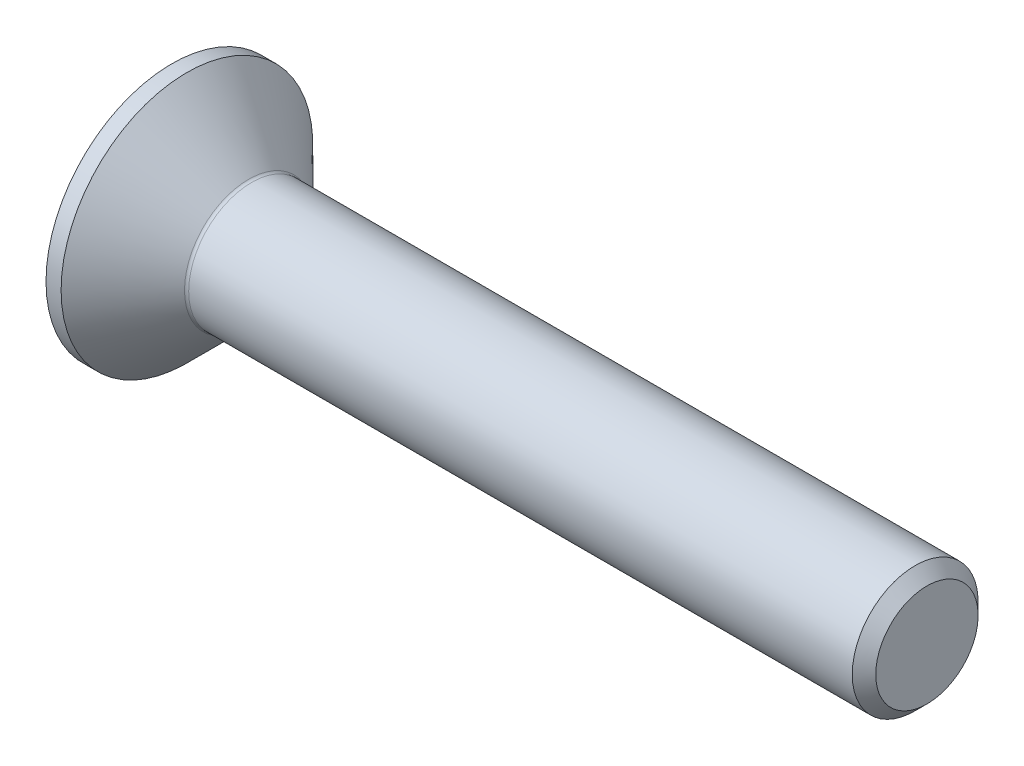
ISO-10303-21;
HEADER;
FILE_DESCRIPTION(('STEP AP214'),'2;1');
FILE_NAME('part.step','',(''),(''),'','','');
FILE_SCHEMA(('AUTOMOTIVE_DESIGN { 1 0 10303 214 1 1 1 1 }'));
ENDSEC;
DATA;
#1=APPLICATION_CONTEXT('core data for automotive mechanical design processes');
#2=APPLICATION_PROTOCOL_DEFINITION('international standard','automotive_design',2000,#1);
#3=PRODUCT_CONTEXT('',#1,'mechanical');
#4=PRODUCT('Part','Part','',(#3));
#5=PRODUCT_RELATED_PRODUCT_CATEGORY('part','',(#4));
#6=PRODUCT_DEFINITION_FORMATION('','',#4);
#7=PRODUCT_DEFINITION_CONTEXT('part definition',#1,'design');
#8=PRODUCT_DEFINITION('design','',#6,#7);
#9=PRODUCT_DEFINITION_SHAPE('','',#8);
#10=(LENGTH_UNIT() NAMED_UNIT(*) SI_UNIT(.MILLI.,.METRE.));
#11=(NAMED_UNIT(*) PLANE_ANGLE_UNIT() SI_UNIT($,.RADIAN.));
#12=(NAMED_UNIT(*) SI_UNIT($,.STERADIAN.) SOLID_ANGLE_UNIT());
#13=UNCERTAINTY_MEASURE_WITH_UNIT(LENGTH_MEASURE(1.E-05),#10,'distance_accuracy_value','');
#14=(GEOMETRIC_REPRESENTATION_CONTEXT(3) GLOBAL_UNCERTAINTY_ASSIGNED_CONTEXT((#13)) GLOBAL_UNIT_ASSIGNED_CONTEXT((#10,
#11,#12)) REPRESENTATION_CONTEXT('',''));
#15=CARTESIAN_POINT('',(0.,0.,0.));
#16=DIRECTION('',(0.,0.,1.));
#17=DIRECTION('',(1.,0.,0.));
#18=AXIS2_PLACEMENT_3D('',#15,#16,#17);
#19=CARTESIAN_POINT('',(0.,0.,0.));
#20=DIRECTION('',(-1.,0.,0.));
#21=DIRECTION('',(0.,0.,1.));
#22=AXIS2_PLACEMENT_3D('',#19,#20,#21);
#23=PLANE('',#22);
#24=CARTESIAN_POINT('',(0.,0.,0.));
#25=DIRECTION('',(-1.,0.,0.));
#26=DIRECTION('',(0.,0.,1.));
#27=AXIS2_PLACEMENT_3D('',#24,#25,#26);
#28=CIRCLE('',#27,3.);
#29=CARTESIAN_POINT('',(0.,0.,3.));
#30=VERTEX_POINT('',#29);
#31=EDGE_CURVE('E154',#30,#30,#28,.T.);
#32=ORIENTED_EDGE('',*,*,#31,.T.);
#33=EDGE_LOOP('',(#32));
#34=FACE_BOUND('',#33,.T.);
#35=DIRECTION('',(0.,-0.499999999999998,-0.86602540378444));
#36=VECTOR('',#35,1.);
#37=CARTESIAN_POINT('',(0.,-0.577350269189626,1.));
#38=LINE('',#37,#36);
#39=CARTESIAN_POINT('',(0.,-0.577350269189626,1.));
#40=VERTEX_POINT('',#39);
#41=CARTESIAN_POINT('',(0.,-1.15470053837925,0.));
#42=VERTEX_POINT('',#41);
#43=EDGE_CURVE('E120',#40,#42,#38,.T.);
#44=ORIENTED_EDGE('',*,*,#43,.T.);
#45=DIRECTION('',(0.,0.499999999999999,-0.866025403784439));
#46=VECTOR('',#45,1.);
#47=CARTESIAN_POINT('',(0.,-1.15470053837925,0.));
#48=LINE('',#47,#46);
#49=CARTESIAN_POINT('',(0.,-0.577350269189625,-1.));
#50=VERTEX_POINT('',#49);
#51=EDGE_CURVE('E51',#42,#50,#48,.T.);
#52=ORIENTED_EDGE('',*,*,#51,.T.);
#53=DIRECTION('',(0.,1.,0.));
#54=VECTOR('',#53,1.);
#55=CARTESIAN_POINT('',(0.,-0.577350269189625,-1.));
#56=LINE('',#55,#54);
#57=CARTESIAN_POINT('',(0.,0.577350269189626,-1.));
#58=VERTEX_POINT('',#57);
#59=EDGE_CURVE('E131',#50,#58,#56,.T.);
#60=ORIENTED_EDGE('',*,*,#59,.T.);
#61=DIRECTION('',(0.,0.5,0.866025403784439));
#62=VECTOR('',#61,1.);
#63=CARTESIAN_POINT('',(0.,0.577350269189626,-1.));
#64=LINE('',#63,#62);
#65=CARTESIAN_POINT('',(0.,1.15470053837925,0.));
#66=VERTEX_POINT('',#65);
#67=EDGE_CURVE('E255',#58,#66,#64,.T.);
#68=ORIENTED_EDGE('',*,*,#67,.T.);
#69=DIRECTION('',(0.,-0.499999999999999,0.866025403784439));
#70=VECTOR('',#69,1.);
#71=CARTESIAN_POINT('',(0.,1.15470053837925,0.));
#72=LINE('',#71,#70);
#73=CARTESIAN_POINT('',(0.,0.577350269189625,0.999999999999999));
#74=VERTEX_POINT('',#73);
#75=EDGE_CURVE('E258',#66,#74,#72,.T.);
#76=ORIENTED_EDGE('',*,*,#75,.T.);
#77=DIRECTION('',(0.,-1.,0.));
#78=VECTOR('',#77,1.);
#79=CARTESIAN_POINT('',(0.,0.577350269189625,0.999999999999999));
#80=LINE('',#79,#78);
#81=EDGE_CURVE('E261',#74,#40,#80,.T.);
#82=ORIENTED_EDGE('',*,*,#81,.T.);
#83=EDGE_LOOP('',(#44,#52,#60,#68,#76,#82));
#84=FACE_BOUND('',#83,.T.);
#85=ADVANCED_FACE('F36',(#34,#84),#23,.T.);
#86=CARTESIAN_POINT('',(0.,0.,0.));
#87=DIRECTION('',(-1.,0.,0.));
#88=DIRECTION('',(0.,0.,1.));
#89=AXIS2_PLACEMENT_3D('',#86,#87,#88);
#90=CYLINDRICAL_SURFACE('',#89,3.);
#91=CARTESIAN_POINT('',(0.36000000000001,0.,0.));
#92=DIRECTION('',(-1.,0.,0.));
#93=DIRECTION('',(0.,0.,1.));
#94=AXIS2_PLACEMENT_3D('',#91,#92,#93);
#95=CIRCLE('',#94,3.);
#96=CARTESIAN_POINT('',(0.36000000000001,0.,3.));
#97=VERTEX_POINT('',#96);
#98=EDGE_CURVE('E151',#97,#97,#95,.T.);
#99=ORIENTED_EDGE('',*,*,#98,.T.);
#100=EDGE_LOOP('',(#99));
#101=FACE_BOUND('',#100,.T.);
#102=ORIENTED_EDGE('',*,*,#31,.F.);
#103=EDGE_LOOP('',(#102));
#104=FACE_BOUND('',#103,.T.);
#105=ADVANCED_FACE('F175',(#101,#104),#90,.T.);
#106=CARTESIAN_POINT('',(0.36000000000001,0.,0.));
#107=DIRECTION('',(-1.,0.,0.));
#108=DIRECTION('',(0.,0.,1.));
#109=AXIS2_PLACEMENT_3D('',#106,#107,#108);
#110=CONICAL_SURFACE('',#109,3.,0.785398163397449);
#111=CARTESIAN_POINT('',(1.83071067811874,0.,0.));
#112=DIRECTION('',(-1.,0.,0.));
#113=DIRECTION('',(0.,0.,1.));
#114=AXIS2_PLACEMENT_3D('',#111,#112,#113);
#115=CIRCLE('',#114,1.52928932188126);
#116=CARTESIAN_POINT('',(1.83071067811874,0.,1.52928932188126));
#117=VERTEX_POINT('',#116);
#118=EDGE_CURVE('E44',#117,#117,#115,.T.);
#119=ORIENTED_EDGE('',*,*,#118,.T.);
#120=EDGE_LOOP('',(#119));
#121=FACE_BOUND('',#120,.T.);
#122=ORIENTED_EDGE('',*,*,#98,.F.);
#123=EDGE_LOOP('',(#122));
#124=FACE_BOUND('',#123,.T.);
#125=ADVANCED_FACE('F159',(#121,#124),#110,.T.);
#126=CARTESIAN_POINT('',(0.,0.,0.));
#127=DIRECTION('',(-1.,0.,0.));
#128=DIRECTION('',(0.,0.,1.));
#129=AXIS2_PLACEMENT_3D('',#126,#127,#128);
#130=CYLINDRICAL_SURFACE('',#129,1.49999999999992);
#131=CARTESIAN_POINT('',(1.9014213562374,0.,0.));
#132=DIRECTION('',(-1.,0.,0.));
#133=DIRECTION('',(0.,0.,1.));
#134=AXIS2_PLACEMENT_3D('',#131,#132,#133);
#135=CIRCLE('',#134,1.49999999999992);
#136=CARTESIAN_POINT('',(1.9014213562374,0.,1.49999999999992));
#137=VERTEX_POINT('',#136);
#138=EDGE_CURVE('E11',#137,#137,#135,.F.);
#139=ORIENTED_EDGE('',*,*,#138,.T.);
#140=EDGE_LOOP('',(#139));
#141=FACE_BOUND('',#140,.T.);
#142=CARTESIAN_POINT('',(17.7194999999998,0.,0.));
#143=DIRECTION('',(-1.,0.,0.));
#144=DIRECTION('',(0.,0.,1.));
#145=AXIS2_PLACEMENT_3D('',#142,#143,#144);
#146=CIRCLE('',#145,1.49999999999983);
#147=CARTESIAN_POINT('',(17.7194999999998,0.,1.49999999999983));
#148=VERTEX_POINT('',#147);
#149=EDGE_CURVE('E148',#148,#148,#146,.T.);
#150=ORIENTED_EDGE('',*,*,#149,.T.);
#151=EDGE_LOOP('',(#150));
#152=FACE_BOUND('',#151,.T.);
#153=ADVANCED_FACE('F186',(#141,#152),#130,.T.);
#154=CARTESIAN_POINT('',(18.,0.,0.));
#155=DIRECTION('',(-1.,0.,0.));
#156=DIRECTION('',(0.,0.,1.));
#157=AXIS2_PLACEMENT_3D('',#154,#155,#156);
#158=CONICAL_SURFACE('',#157,1.2195,0.785398163396876);
#159=ORIENTED_EDGE('',*,*,#149,.F.);
#160=EDGE_LOOP('',(#159));
#161=FACE_BOUND('',#160,.T.);
#162=CARTESIAN_POINT('',(18.,0.,0.));
#163=DIRECTION('',(-1.,0.,0.));
#164=DIRECTION('',(0.,0.,1.));
#165=AXIS2_PLACEMENT_3D('',#162,#163,#164);
#166=CIRCLE('',#165,1.2195);
#167=CARTESIAN_POINT('',(18.,0.,1.2195));
#168=VERTEX_POINT('',#167);
#169=EDGE_CURVE('E144',#168,#168,#166,.T.);
#170=ORIENTED_EDGE('',*,*,#169,.T.);
#171=EDGE_LOOP('',(#170));
#172=FACE_BOUND('',#171,.T.);
#173=ADVANCED_FACE('F170',(#161,#172),#158,.T.);
#174=CARTESIAN_POINT('',(18.,1.2195,0.));
#175=DIRECTION('',(1.,0.,0.));
#176=DIRECTION('',(0.,0.,-1.));
#177=AXIS2_PLACEMENT_3D('',#174,#175,#176);
#178=PLANE('',#177);
#179=ORIENTED_EDGE('',*,*,#169,.F.);
#180=EDGE_LOOP('',(#179));
#181=FACE_BOUND('',#180,.T.);
#182=ADVANCED_FACE('F163',(#181),#178,.T.);
#183=CARTESIAN_POINT('',(1.9014213562374,0.,0.));
#184=DIRECTION('',(-1.,0.,0.));
#185=DIRECTION('',(0.,0.,1.));
#186=AXIS2_PLACEMENT_3D('',#183,#184,#185);
#187=TOROIDAL_SURFACE('',#186,1.59999999999992,0.1);
#188=ORIENTED_EDGE('',*,*,#138,.F.);
#189=EDGE_LOOP('',(#188));
#190=FACE_BOUND('',#189,.T.);
#191=ORIENTED_EDGE('',*,*,#118,.F.);
#192=EDGE_LOOP('',(#191));
#193=FACE_BOUND('',#192,.T.);
#194=ADVANCED_FACE('F38',(#190,#193),#187,.F.);
#195=CARTESIAN_POINT('',(1.1,-1.15470053837925,0.));
#196=DIRECTION('',(0.,0.866025403784439,0.499999999999999));
#197=DIRECTION('',(0.,-0.499999999999999,0.866025403784439));
#198=AXIS2_PLACEMENT_3D('',#195,#196,#197);
#199=PLANE('',#198);
#200=ORIENTED_EDGE('',*,*,#51,.F.);
#201=DIRECTION('',(-1.,0.,0.));
#202=VECTOR('',#201,1.);
#203=CARTESIAN_POINT('',(1.1,-1.15470053837925,0.));
#204=LINE('',#203,#202);
#205=CARTESIAN_POINT('',(1.1,-1.15470053837925,0.));
#206=VERTEX_POINT('',#205);
#207=EDGE_CURVE('E252',#206,#42,#204,.T.);
#208=ORIENTED_EDGE('',*,*,#207,.F.);
#209=DIRECTION('',(0.,0.499999999999999,-0.866025403784439));
#210=VECTOR('',#209,1.);
#211=CARTESIAN_POINT('',(1.1,-1.15470053837925,0.));
#212=LINE('',#211,#210);
#213=CARTESIAN_POINT('',(1.1,-0.866025403784438,-0.499999999999998));
#214=VERTEX_POINT('',#213);
#215=EDGE_CURVE('E116',#206,#214,#212,.T.);
#216=ORIENTED_EDGE('',*,*,#215,.T.);
#217=CARTESIAN_POINT('',(1.1,-0.577350269189625,-1.));
#218=VERTEX_POINT('',#217);
#219=EDGE_CURVE('E112',#214,#218,#212,.T.);
#220=ORIENTED_EDGE('',*,*,#219,.T.);
#221=DIRECTION('',(-1.,0.,0.));
#222=VECTOR('',#221,1.);
#223=CARTESIAN_POINT('',(1.1,-0.577350269189625,-1.));
#224=LINE('',#223,#222);
#225=EDGE_CURVE('E114',#218,#50,#224,.T.);
#226=ORIENTED_EDGE('',*,*,#225,.T.);
#227=EDGE_LOOP('',(#200,#208,#216,#220,#226));
#228=FACE_BOUND('',#227,.T.);
#229=ADVANCED_FACE('F113',(#228),#199,.T.);
#230=CARTESIAN_POINT('',(1.1,-0.577350269189625,-1.));
#231=DIRECTION('',(0.,0.,1.));
#232=DIRECTION('',(1.,0.,0.));
#233=AXIS2_PLACEMENT_3D('',#230,#231,#232);
#234=PLANE('',#233);
#235=ORIENTED_EDGE('',*,*,#59,.F.);
#236=ORIENTED_EDGE('',*,*,#225,.F.);
#237=DIRECTION('',(0.,1.,0.));
#238=VECTOR('',#237,1.);
#239=CARTESIAN_POINT('',(1.1,-0.577350269189625,-1.));
#240=LINE('',#239,#238);
#241=CARTESIAN_POINT('',(1.1,0.,-1.));
#242=VERTEX_POINT('',#241);
#243=EDGE_CURVE('E59',#218,#242,#240,.T.);
#244=ORIENTED_EDGE('',*,*,#243,.T.);
#245=CARTESIAN_POINT('',(1.1,0.577350269189626,-1.));
#246=VERTEX_POINT('',#245);
#247=EDGE_CURVE('E126',#242,#246,#240,.T.);
#248=ORIENTED_EDGE('',*,*,#247,.T.);
#249=DIRECTION('',(-1.,0.,0.));
#250=VECTOR('',#249,1.);
#251=CARTESIAN_POINT('',(1.1,0.577350269189626,-1.));
#252=LINE('',#251,#250);
#253=EDGE_CURVE('E133',#246,#58,#252,.T.);
#254=ORIENTED_EDGE('',*,*,#253,.T.);
#255=EDGE_LOOP('',(#235,#236,#244,#248,#254));
#256=FACE_BOUND('',#255,.T.);
#257=ADVANCED_FACE('F128',(#256),#234,.T.);
#258=CARTESIAN_POINT('',(1.1,0.577350269189626,-1.));
#259=DIRECTION('',(0.,-0.866025403784438,0.5));
#260=DIRECTION('',(0.,-0.5,-0.866025403784439));
#261=AXIS2_PLACEMENT_3D('',#258,#259,#260);
#262=PLANE('',#261);
#263=ORIENTED_EDGE('',*,*,#67,.F.);
#264=ORIENTED_EDGE('',*,*,#253,.F.);
#265=DIRECTION('',(0.,0.5,0.866025403784439));
#266=VECTOR('',#265,1.);
#267=CARTESIAN_POINT('',(1.1,0.577350269189626,-1.));
#268=LINE('',#267,#266);
#269=CARTESIAN_POINT('',(1.1,0.866025403784439,-0.5));
#270=VERTEX_POINT('',#269);
#271=EDGE_CURVE('E233',#246,#270,#268,.T.);
#272=ORIENTED_EDGE('',*,*,#271,.T.);
#273=CARTESIAN_POINT('',(1.1,1.15470053837925,0.));
#274=VERTEX_POINT('',#273);
#275=EDGE_CURVE('E125',#270,#274,#268,.T.);
#276=ORIENTED_EDGE('',*,*,#275,.T.);
#277=DIRECTION('',(-1.,0.,0.));
#278=VECTOR('',#277,1.);
#279=CARTESIAN_POINT('',(1.1,1.15470053837925,0.));
#280=LINE('',#279,#278);
#281=EDGE_CURVE('E139',#274,#66,#280,.T.);
#282=ORIENTED_EDGE('',*,*,#281,.T.);
#283=EDGE_LOOP('',(#263,#264,#272,#276,#282));
#284=FACE_BOUND('',#283,.T.);
#285=ADVANCED_FACE('F200',(#284),#262,.T.);
#286=CARTESIAN_POINT('',(1.1,1.15470053837925,0.));
#287=DIRECTION('',(0.,-0.866025403784439,-0.499999999999999));
#288=DIRECTION('',(0.,0.499999999999999,-0.866025403784439));
#289=AXIS2_PLACEMENT_3D('',#286,#287,#288);
#290=PLANE('',#289);
#291=ORIENTED_EDGE('',*,*,#75,.F.);
#292=ORIENTED_EDGE('',*,*,#281,.F.);
#293=DIRECTION('',(0.,-0.499999999999999,0.866025403784439));
#294=VECTOR('',#293,1.);
#295=CARTESIAN_POINT('',(1.1,1.15470053837925,0.));
#296=LINE('',#295,#294);
#297=CARTESIAN_POINT('',(1.1,0.866025403784438,0.499999999999999));
#298=VERTEX_POINT('',#297);
#299=EDGE_CURVE('E240',#274,#298,#296,.T.);
#300=ORIENTED_EDGE('',*,*,#299,.T.);
#301=CARTESIAN_POINT('',(1.1,0.577350269189625,0.999999999999999));
#302=VERTEX_POINT('',#301);
#303=EDGE_CURVE('E238',#298,#302,#296,.T.);
#304=ORIENTED_EDGE('',*,*,#303,.T.);
#305=DIRECTION('',(-1.,0.,0.));
#306=VECTOR('',#305,1.);
#307=CARTESIAN_POINT('',(1.1,0.577350269189625,0.999999999999999));
#308=LINE('',#307,#306);
#309=EDGE_CURVE('E270',#302,#74,#308,.T.);
#310=ORIENTED_EDGE('',*,*,#309,.T.);
#311=EDGE_LOOP('',(#291,#292,#300,#304,#310));
#312=FACE_BOUND('',#311,.T.);
#313=ADVANCED_FACE('F203',(#312),#290,.T.);
#314=CARTESIAN_POINT('',(1.1,0.577350269189625,0.999999999999999));
#315=DIRECTION('',(0.,0.,-1.));
#316=DIRECTION('',(0.,1.,0.));
#317=AXIS2_PLACEMENT_3D('',#314,#315,#316);
#318=PLANE('',#317);
#319=ORIENTED_EDGE('',*,*,#81,.F.);
#320=ORIENTED_EDGE('',*,*,#309,.F.);
#321=DIRECTION('',(0.,-1.,0.));
#322=VECTOR('',#321,1.);
#323=CARTESIAN_POINT('',(1.1,0.577350269189625,0.999999999999999));
#324=LINE('',#323,#322);
#325=CARTESIAN_POINT('',(1.1,0.,1.));
#326=VERTEX_POINT('',#325);
#327=EDGE_CURVE('E245',#302,#326,#324,.T.);
#328=ORIENTED_EDGE('',*,*,#327,.T.);
#329=CARTESIAN_POINT('',(1.1,-0.577350269189626,1.));
#330=VERTEX_POINT('',#329);
#331=EDGE_CURVE('E244',#326,#330,#324,.T.);
#332=ORIENTED_EDGE('',*,*,#331,.T.);
#333=DIRECTION('',(-1.,0.,0.));
#334=VECTOR('',#333,1.);
#335=CARTESIAN_POINT('',(1.1,-0.577350269189626,1.));
#336=LINE('',#335,#334);
#337=EDGE_CURVE('E267',#330,#40,#336,.T.);
#338=ORIENTED_EDGE('',*,*,#337,.T.);
#339=EDGE_LOOP('',(#319,#320,#328,#332,#338));
#340=FACE_BOUND('',#339,.T.);
#341=ADVANCED_FACE('F207',(#340),#318,.T.);
#342=CARTESIAN_POINT('',(1.1,-0.577350269189626,1.));
#343=DIRECTION('',(0.,0.86602540378444,-0.499999999999998));
#344=DIRECTION('',(0.,0.499999999999998,0.86602540378444));
#345=AXIS2_PLACEMENT_3D('',#342,#343,#344);
#346=PLANE('',#345);
#347=ORIENTED_EDGE('',*,*,#43,.F.);
#348=ORIENTED_EDGE('',*,*,#337,.F.);
#349=DIRECTION('',(0.,-0.499999999999998,-0.86602540378444));
#350=VECTOR('',#349,1.);
#351=CARTESIAN_POINT('',(1.1,-0.577350269189626,1.));
#352=LINE('',#351,#350);
#353=CARTESIAN_POINT('',(1.1,-0.866025403784439,0.499999999999997));
#354=VERTEX_POINT('',#353);
#355=EDGE_CURVE('E249',#330,#354,#352,.T.);
#356=ORIENTED_EDGE('',*,*,#355,.T.);
#357=EDGE_CURVE('E248',#354,#206,#352,.T.);
#358=ORIENTED_EDGE('',*,*,#357,.T.);
#359=ORIENTED_EDGE('',*,*,#207,.T.);
#360=EDGE_LOOP('',(#347,#348,#356,#358,#359));
#361=FACE_BOUND('',#360,.T.);
#362=ADVANCED_FACE('F211',(#361),#346,.T.);
#363=CARTESIAN_POINT('',(1.1,-0.577350269189626,-1.));
#364=DIRECTION('',(1.,0.,0.));
#365=DIRECTION('',(0.,0.,-1.));
#366=AXIS2_PLACEMENT_3D('',#363,#364,#365);
#367=PLANE('',#366);
#368=ORIENTED_EDGE('',*,*,#243,.F.);
#369=ORIENTED_EDGE('',*,*,#219,.F.);
#370=CARTESIAN_POINT('',(1.1,0.,0.));
#371=DIRECTION('',(-1.,0.,0.));
#372=DIRECTION('',(0.,0.,1.));
#373=AXIS2_PLACEMENT_3D('',#370,#371,#372);
#374=CIRCLE('',#373,1.);
#375=EDGE_CURVE('E123',#242,#214,#374,.T.);
#376=ORIENTED_EDGE('',*,*,#375,.F.);
#377=EDGE_LOOP('',(#368,#369,#376));
#378=FACE_BOUND('',#377,.T.);
#379=ADVANCED_FACE('F122',(#378),#367,.F.);
#380=ORIENTED_EDGE('',*,*,#215,.F.);
#381=ORIENTED_EDGE('',*,*,#357,.F.);
#382=EDGE_CURVE('E136',#214,#354,#374,.T.);
#383=ORIENTED_EDGE('',*,*,#382,.F.);
#384=EDGE_LOOP('',(#380,#381,#383));
#385=FACE_BOUND('',#384,.T.);
#386=ADVANCED_FACE('F217',(#385),#367,.F.);
#387=ORIENTED_EDGE('',*,*,#355,.F.);
#388=ORIENTED_EDGE('',*,*,#331,.F.);
#389=EDGE_CURVE('E132',#354,#326,#374,.T.);
#390=ORIENTED_EDGE('',*,*,#389,.F.);
#391=EDGE_LOOP('',(#387,#388,#390));
#392=FACE_BOUND('',#391,.T.);
#393=ADVANCED_FACE('F221',(#392),#367,.F.);
#394=ORIENTED_EDGE('',*,*,#327,.F.);
#395=ORIENTED_EDGE('',*,*,#303,.F.);
#396=EDGE_CURVE('E138',#326,#298,#374,.T.);
#397=ORIENTED_EDGE('',*,*,#396,.F.);
#398=EDGE_LOOP('',(#394,#395,#397));
#399=FACE_BOUND('',#398,.T.);
#400=ADVANCED_FACE('F229',(#399),#367,.F.);
#401=ORIENTED_EDGE('',*,*,#299,.F.);
#402=ORIENTED_EDGE('',*,*,#275,.F.);
#403=EDGE_CURVE('E145',#298,#270,#374,.T.);
#404=ORIENTED_EDGE('',*,*,#403,.F.);
#405=EDGE_LOOP('',(#401,#402,#404));
#406=FACE_BOUND('',#405,.T.);
#407=ADVANCED_FACE('F224',(#406),#367,.F.);
#408=ORIENTED_EDGE('',*,*,#271,.F.);
#409=ORIENTED_EDGE('',*,*,#247,.F.);
#410=EDGE_CURVE('E234',#270,#242,#374,.T.);
#411=ORIENTED_EDGE('',*,*,#410,.F.);
#412=EDGE_LOOP('',(#408,#409,#411));
#413=FACE_BOUND('',#412,.T.);
#414=ADVANCED_FACE('F195',(#413),#367,.F.);
#415=CARTESIAN_POINT('',(1.1,0.,0.));
#416=DIRECTION('',(-1.,0.,0.));
#417=DIRECTION('',(0.,0.,1.));
#418=AXIS2_PLACEMENT_3D('',#415,#416,#417);
#419=CONICAL_SURFACE('',#418,1.,1.04719755119659);
#420=CARTESIAN_POINT('',(1.67735026918963,0.,0.));
#421=VERTEX_POINT('',#420);
#422=VERTEX_LOOP('',#421);
#423=FACE_BOUND('',#422,.T.);
#424=ORIENTED_EDGE('',*,*,#396,.T.);
#425=ORIENTED_EDGE('',*,*,#403,.T.);
#426=ORIENTED_EDGE('',*,*,#410,.T.);
#427=ORIENTED_EDGE('',*,*,#375,.T.);
#428=ORIENTED_EDGE('',*,*,#382,.T.);
#429=ORIENTED_EDGE('',*,*,#389,.T.);
#430=EDGE_LOOP('',(#424,#425,#426,#427,#428,#429));
#431=FACE_BOUND('',#430,.T.);
#432=ADVANCED_FACE('F193',(#423,#431),#419,.F.);
#433=CLOSED_SHELL('',(#85,#105,#125,#153,#173,#182,#194,#229,#257,#285,#313,#341,#362,#379,#386,
#393,#400,#407,#414,#432));
#434=MANIFOLD_SOLID_BREP('B2',#433);
#435=ADVANCED_BREP_SHAPE_REPRESENTATION('',(#18,#434),#14);
#436=SHAPE_DEFINITION_REPRESENTATION(#9,#435);
ENDSEC;
END-ISO-10303-21;
